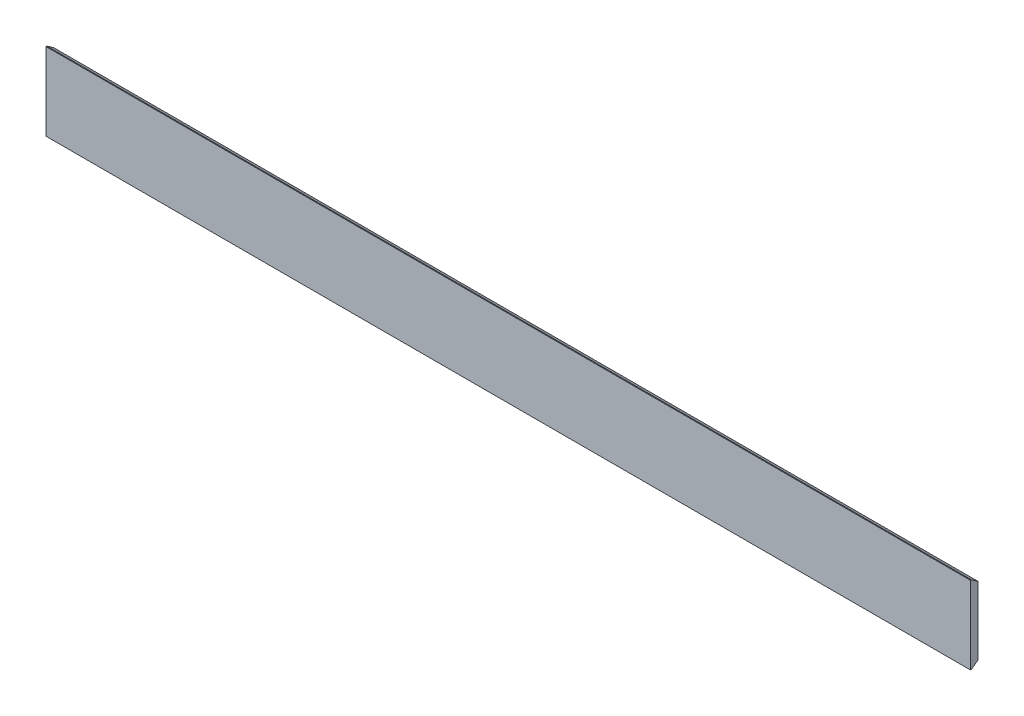
ISO-10303-21;
HEADER;
FILE_DESCRIPTION(('STEP AP214'),'2;1');
FILE_NAME('part.step','',(''),(''),'','','');
FILE_SCHEMA(('AUTOMOTIVE_DESIGN { 1 0 10303 214 1 1 1 1 }'));
ENDSEC;
DATA;
#1=APPLICATION_CONTEXT('core data for automotive mechanical design processes');
#2=APPLICATION_PROTOCOL_DEFINITION('international standard','automotive_design',2000,#1);
#3=PRODUCT_CONTEXT('',#1,'mechanical');
#4=PRODUCT('Part','Part','',(#3));
#5=PRODUCT_RELATED_PRODUCT_CATEGORY('part','',(#4));
#6=PRODUCT_DEFINITION_FORMATION('','',#4);
#7=PRODUCT_DEFINITION_CONTEXT('part definition',#1,'design');
#8=PRODUCT_DEFINITION('design','',#6,#7);
#9=PRODUCT_DEFINITION_SHAPE('','',#8);
#10=(LENGTH_UNIT() NAMED_UNIT(*) SI_UNIT(.MILLI.,.METRE.));
#11=(NAMED_UNIT(*) PLANE_ANGLE_UNIT() SI_UNIT($,.RADIAN.));
#12=(NAMED_UNIT(*) SI_UNIT($,.STERADIAN.) SOLID_ANGLE_UNIT());
#13=UNCERTAINTY_MEASURE_WITH_UNIT(LENGTH_MEASURE(1.E-05),#10,'distance_accuracy_value','');
#14=(GEOMETRIC_REPRESENTATION_CONTEXT(3) GLOBAL_UNCERTAINTY_ASSIGNED_CONTEXT((#13)) GLOBAL_UNIT_ASSIGNED_CONTEXT((#10,
#11,#12)) REPRESENTATION_CONTEXT('',''));
#15=CARTESIAN_POINT('',(0.,0.,0.));
#16=DIRECTION('',(0.,0.,1.));
#17=DIRECTION('',(1.,0.,0.));
#18=AXIS2_PLACEMENT_3D('',#15,#16,#17);
#19=CARTESIAN_POINT('',(1095.,92.0000000000001,-18.));
#20=DIRECTION('',(1.,0.,0.));
#21=DIRECTION('',(0.,0.,-1.));
#22=AXIS2_PLACEMENT_3D('',#19,#20,#21);
#23=PLANE('',#22);
#24=DIRECTION('',(0.,0.573576436351041,-0.819152044288995));
#25=VECTOR('',#24,1.);
#26=CARTESIAN_POINT('',(1095.,-80.7966793886447,-18.));
#27=LINE('',#26,#25);
#28=CARTESIAN_POINT('',(1095.,-92.,-2.));
#29=VERTEX_POINT('',#28);
#30=CARTESIAN_POINT('',(1095.,-80.7966793886447,-18.));
#31=VERTEX_POINT('',#30);
#32=EDGE_CURVE('E90',#29,#31,#27,.T.);
#33=ORIENTED_EDGE('',*,*,#32,.T.);
#34=DIRECTION('',(0.,1.,0.));
#35=VECTOR('',#34,1.);
#36=CARTESIAN_POINT('',(1095.,92.0000000000001,-18.));
#37=LINE('',#36,#35);
#38=CARTESIAN_POINT('',(1095.,80.7966793886448,-18.));
#39=VERTEX_POINT('',#38);
#40=EDGE_CURVE('E62',#31,#39,#37,.T.);
#41=ORIENTED_EDGE('',*,*,#40,.T.);
#42=DIRECTION('',(0.,0.573576436351042,0.819152044288995));
#43=VECTOR('',#42,1.);
#44=CARTESIAN_POINT('',(1095.,80.7966793886448,-18.));
#45=LINE('',#44,#43);
#46=CARTESIAN_POINT('',(1095.,92.0000000000001,-2.));
#47=VERTEX_POINT('',#46);
#48=EDGE_CURVE('E143',#39,#47,#45,.T.);
#49=ORIENTED_EDGE('',*,*,#48,.T.);
#50=DIRECTION('',(0.,0.,1.));
#51=VECTOR('',#50,1.);
#52=CARTESIAN_POINT('',(1095.,92.0000000000001,-18.));
#53=LINE('',#52,#51);
#54=CARTESIAN_POINT('',(1095.,92.0000000000001,0.));
#55=VERTEX_POINT('',#54);
#56=EDGE_CURVE('E41',#47,#55,#53,.T.);
#57=ORIENTED_EDGE('',*,*,#56,.T.);
#58=DIRECTION('',(0.,1.,0.));
#59=VECTOR('',#58,1.);
#60=CARTESIAN_POINT('',(1095.,92.0000000000001,0.));
#61=LINE('',#60,#59);
#62=CARTESIAN_POINT('',(1095.,-92.,0.));
#63=VERTEX_POINT('',#62);
#64=EDGE_CURVE('E104',#63,#55,#61,.T.);
#65=ORIENTED_EDGE('',*,*,#64,.F.);
#66=DIRECTION('',(0.,0.,1.));
#67=VECTOR('',#66,1.);
#68=CARTESIAN_POINT('',(1095.,-92.,-18.));
#69=LINE('',#68,#67);
#70=EDGE_CURVE('E11',#29,#63,#69,.T.);
#71=ORIENTED_EDGE('',*,*,#70,.F.);
#72=EDGE_LOOP('',(#33,#41,#49,#57,#65,#71));
#73=FACE_BOUND('',#72,.T.);
#74=ADVANCED_FACE('F38',(#73),#23,.T.);
#75=CARTESIAN_POINT('',(-1095.,-92.,-18.));
#76=DIRECTION('',(0.,-1.,0.));
#77=DIRECTION('',(0.,0.,-1.));
#78=AXIS2_PLACEMENT_3D('',#75,#76,#77);
#79=PLANE('',#78);
#80=DIRECTION('',(-1.,0.,0.));
#81=VECTOR('',#80,1.);
#82=CARTESIAN_POINT('',(1095.,-92.,-2.));
#83=LINE('',#82,#81);
#84=CARTESIAN_POINT('',(-1095.,-92.,-2.));
#85=VERTEX_POINT('',#84);
#86=EDGE_CURVE('E93',#29,#85,#83,.T.);
#87=ORIENTED_EDGE('',*,*,#86,.F.);
#88=ORIENTED_EDGE('',*,*,#70,.T.);
#89=DIRECTION('',(1.,0.,0.));
#90=VECTOR('',#89,1.);
#91=CARTESIAN_POINT('',(-1095.,-92.,0.));
#92=LINE('',#91,#90);
#93=CARTESIAN_POINT('',(-1095.,-92.,0.));
#94=VERTEX_POINT('',#93);
#95=EDGE_CURVE('E114',#94,#63,#92,.T.);
#96=ORIENTED_EDGE('',*,*,#95,.F.);
#97=DIRECTION('',(0.,0.,1.));
#98=VECTOR('',#97,1.);
#99=CARTESIAN_POINT('',(-1095.,-92.,-18.));
#100=LINE('',#99,#98);
#101=EDGE_CURVE('E46',#85,#94,#100,.T.);
#102=ORIENTED_EDGE('',*,*,#101,.F.);
#103=EDGE_LOOP('',(#87,#88,#96,#102));
#104=FACE_BOUND('',#103,.T.);
#105=ADVANCED_FACE('F99',(#104),#79,.T.);
#106=CARTESIAN_POINT('',(-1095.,92.0000000000001,-18.));
#107=DIRECTION('',(-1.,0.,0.));
#108=DIRECTION('',(0.,0.,1.));
#109=AXIS2_PLACEMENT_3D('',#106,#107,#108);
#110=PLANE('',#109);
#111=DIRECTION('',(0.,0.573576436351041,-0.819152044288995));
#112=VECTOR('',#111,1.);
#113=CARTESIAN_POINT('',(-1095.,-80.7966793886447,-18.));
#114=LINE('',#113,#112);
#115=CARTESIAN_POINT('',(-1095.,-80.7966793886448,-18.));
#116=VERTEX_POINT('',#115);
#117=EDGE_CURVE('E54',#85,#116,#114,.T.);
#118=ORIENTED_EDGE('',*,*,#117,.F.);
#119=ORIENTED_EDGE('',*,*,#101,.T.);
#120=DIRECTION('',(0.,-1.,0.));
#121=VECTOR('',#120,1.);
#122=CARTESIAN_POINT('',(-1095.,92.0000000000001,0.));
#123=LINE('',#122,#121);
#124=CARTESIAN_POINT('',(-1095.,92.0000000000001,0.));
#125=VERTEX_POINT('',#124);
#126=EDGE_CURVE('E117',#125,#94,#123,.T.);
#127=ORIENTED_EDGE('',*,*,#126,.F.);
#128=DIRECTION('',(0.,0.,1.));
#129=VECTOR('',#128,1.);
#130=CARTESIAN_POINT('',(-1095.,92.0000000000001,-18.));
#131=LINE('',#130,#129);
#132=CARTESIAN_POINT('',(-1095.,92.0000000000001,-2.));
#133=VERTEX_POINT('',#132);
#134=EDGE_CURVE('E124',#133,#125,#131,.T.);
#135=ORIENTED_EDGE('',*,*,#134,.F.);
#136=DIRECTION('',(0.,0.573576436351042,0.819152044288995));
#137=VECTOR('',#136,1.);
#138=CARTESIAN_POINT('',(-1095.,80.7966793886448,-18.));
#139=LINE('',#138,#137);
#140=CARTESIAN_POINT('',(-1095.,80.7966793886448,-18.));
#141=VERTEX_POINT('',#140);
#142=EDGE_CURVE('E139',#141,#133,#139,.T.);
#143=ORIENTED_EDGE('',*,*,#142,.F.);
#144=DIRECTION('',(0.,-1.,0.));
#145=VECTOR('',#144,1.);
#146=CARTESIAN_POINT('',(-1095.,92.0000000000001,-18.));
#147=LINE('',#146,#145);
#148=EDGE_CURVE('E119',#141,#116,#147,.T.);
#149=ORIENTED_EDGE('',*,*,#148,.T.);
#150=EDGE_LOOP('',(#118,#119,#127,#135,#143,#149));
#151=FACE_BOUND('',#150,.T.);
#152=ADVANCED_FACE('F138',(#151),#110,.T.);
#153=CARTESIAN_POINT('',(-1095.,92.0000000000001,-18.));
#154=DIRECTION('',(0.,1.,0.));
#155=DIRECTION('',(0.,0.,1.));
#156=AXIS2_PLACEMENT_3D('',#153,#154,#155);
#157=PLANE('',#156);
#158=DIRECTION('',(-1.,0.,0.));
#159=VECTOR('',#158,1.);
#160=CARTESIAN_POINT('',(1095.,92.0000000000001,-2.));
#161=LINE('',#160,#159);
#162=EDGE_CURVE('E111',#47,#133,#161,.T.);
#163=ORIENTED_EDGE('',*,*,#162,.T.);
#164=ORIENTED_EDGE('',*,*,#134,.T.);
#165=DIRECTION('',(-1.,0.,0.));
#166=VECTOR('',#165,1.);
#167=CARTESIAN_POINT('',(-1095.,92.0000000000001,0.));
#168=LINE('',#167,#166);
#169=EDGE_CURVE('E110',#55,#125,#168,.T.);
#170=ORIENTED_EDGE('',*,*,#169,.F.);
#171=ORIENTED_EDGE('',*,*,#56,.F.);
#172=EDGE_LOOP('',(#163,#164,#170,#171));
#173=FACE_BOUND('',#172,.T.);
#174=ADVANCED_FACE('F134',(#173),#157,.T.);
#175=CARTESIAN_POINT('',(0.,0.,-18.));
#176=DIRECTION('',(0.,0.,1.));
#177=DIRECTION('',(1.,0.,0.));
#178=AXIS2_PLACEMENT_3D('',#175,#176,#177);
#179=PLANE('',#178);
#180=ORIENTED_EDGE('',*,*,#40,.F.);
#181=DIRECTION('',(-1.,0.,0.));
#182=VECTOR('',#181,1.);
#183=CARTESIAN_POINT('',(1095.,-80.7966793886447,-18.));
#184=LINE('',#183,#182);
#185=EDGE_CURVE('E94',#31,#116,#184,.T.);
#186=ORIENTED_EDGE('',*,*,#185,.T.);
#187=ORIENTED_EDGE('',*,*,#148,.F.);
#188=DIRECTION('',(-1.,0.,0.));
#189=VECTOR('',#188,1.);
#190=CARTESIAN_POINT('',(1095.,80.7966793886448,-18.));
#191=LINE('',#190,#189);
#192=EDGE_CURVE('E136',#39,#141,#191,.T.);
#193=ORIENTED_EDGE('',*,*,#192,.F.);
#194=EDGE_LOOP('',(#180,#186,#187,#193));
#195=FACE_BOUND('',#194,.T.);
#196=ADVANCED_FACE('F148',(#195),#179,.F.);
#197=CARTESIAN_POINT('',(0.,0.,0.));
#198=DIRECTION('',(0.,0.,1.));
#199=DIRECTION('',(1.,0.,0.));
#200=AXIS2_PLACEMENT_3D('',#197,#198,#199);
#201=PLANE('',#200);
#202=ORIENTED_EDGE('',*,*,#64,.T.);
#203=ORIENTED_EDGE('',*,*,#169,.T.);
#204=ORIENTED_EDGE('',*,*,#126,.T.);
#205=ORIENTED_EDGE('',*,*,#95,.T.);
#206=EDGE_LOOP('',(#202,#203,#204,#205));
#207=FACE_BOUND('',#206,.T.);
#208=ADVANCED_FACE('F115',(#207),#201,.T.);
#209=CARTESIAN_POINT('',(1095.,80.7966793886448,-18.));
#210=DIRECTION('',(0.,-0.819152044288995,0.573576436351042));
#211=DIRECTION('',(0.,-0.573576436351042,-0.819152044288995));
#212=AXIS2_PLACEMENT_3D('',#209,#210,#211);
#213=PLANE('',#212);
#214=ORIENTED_EDGE('',*,*,#142,.T.);
#215=ORIENTED_EDGE('',*,*,#162,.F.);
#216=ORIENTED_EDGE('',*,*,#48,.F.);
#217=ORIENTED_EDGE('',*,*,#192,.T.);
#218=EDGE_LOOP('',(#214,#215,#216,#217));
#219=FACE_BOUND('',#218,.T.);
#220=ADVANCED_FACE('F146',(#219),#213,.F.);
#221=CARTESIAN_POINT('',(1095.,-80.7966793886447,-18.));
#222=DIRECTION('',(0.,0.819152044288995,0.573576436351041));
#223=DIRECTION('',(0.,-0.573576436351041,0.819152044288995));
#224=AXIS2_PLACEMENT_3D('',#221,#222,#223);
#225=PLANE('',#224);
#226=ORIENTED_EDGE('',*,*,#117,.T.);
#227=ORIENTED_EDGE('',*,*,#185,.F.);
#228=ORIENTED_EDGE('',*,*,#32,.F.);
#229=ORIENTED_EDGE('',*,*,#86,.T.);
#230=EDGE_LOOP('',(#226,#227,#228,#229));
#231=FACE_BOUND('',#230,.T.);
#232=ADVANCED_FACE('F92',(#231),#225,.F.);
#233=CLOSED_SHELL('',(#74,#105,#152,#174,#196,#208,#220,#232));
#234=MANIFOLD_SOLID_BREP('B2',#233);
#235=ADVANCED_BREP_SHAPE_REPRESENTATION('',(#18,#234),#14);
#236=SHAPE_DEFINITION_REPRESENTATION(#9,#235);
ENDSEC;
END-ISO-10303-21;
